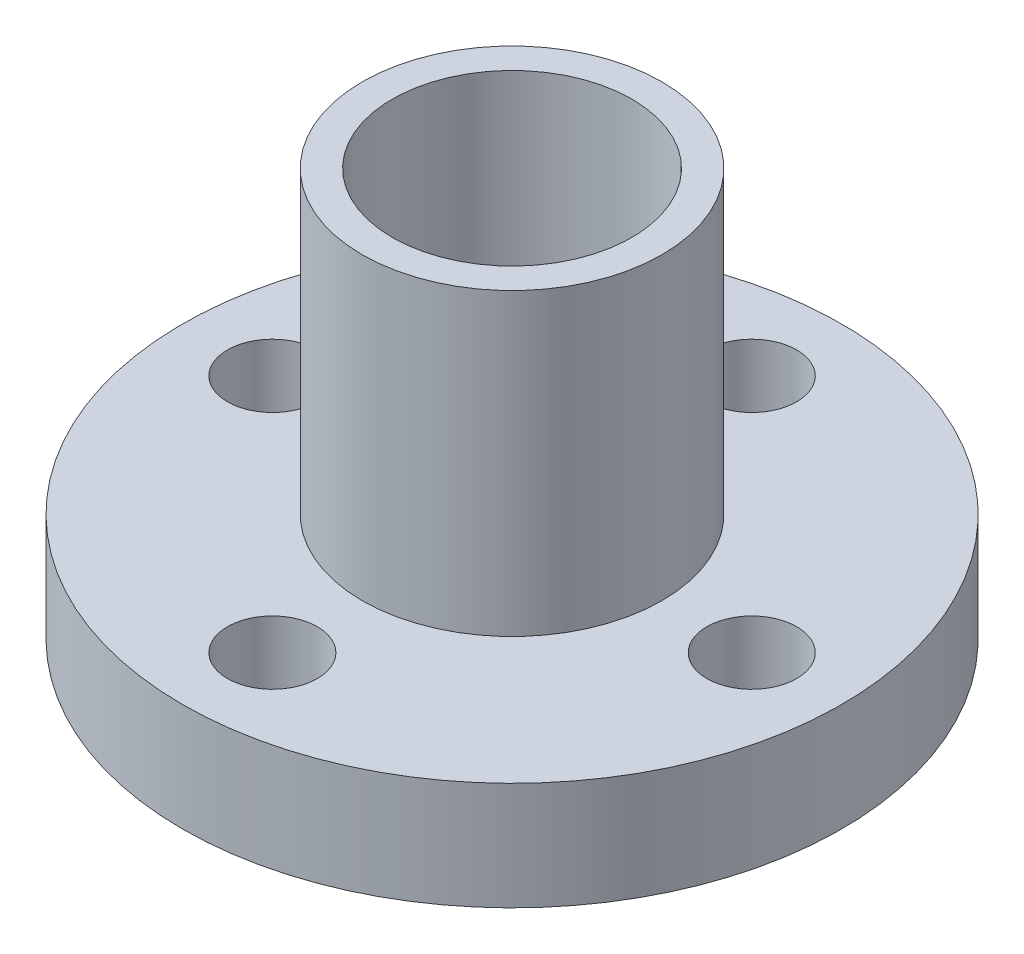
ISO-10303-21;
HEADER;
FILE_DESCRIPTION(('STEP AP214'),'2;1');
FILE_NAME('part.step','',(''),(''),'','','');
FILE_SCHEMA(('AUTOMOTIVE_DESIGN { 1 0 10303 214 1 1 1 1 }'));
ENDSEC;
DATA;
#1=APPLICATION_CONTEXT('core data for automotive mechanical design processes');
#2=APPLICATION_PROTOCOL_DEFINITION('international standard','automotive_design',2000,#1);
#3=PRODUCT_CONTEXT('',#1,'mechanical');
#4=PRODUCT('Part','Part','',(#3));
#5=PRODUCT_RELATED_PRODUCT_CATEGORY('part','',(#4));
#6=PRODUCT_DEFINITION_FORMATION('','',#4);
#7=PRODUCT_DEFINITION_CONTEXT('part definition',#1,'design');
#8=PRODUCT_DEFINITION('design','',#6,#7);
#9=PRODUCT_DEFINITION_SHAPE('','',#8);
#10=(LENGTH_UNIT() NAMED_UNIT(*) SI_UNIT(.MILLI.,.METRE.));
#11=(NAMED_UNIT(*) PLANE_ANGLE_UNIT() SI_UNIT($,.RADIAN.));
#12=(NAMED_UNIT(*) SI_UNIT($,.STERADIAN.) SOLID_ANGLE_UNIT());
#13=UNCERTAINTY_MEASURE_WITH_UNIT(LENGTH_MEASURE(1.E-05),#10,'distance_accuracy_value','');
#14=(GEOMETRIC_REPRESENTATION_CONTEXT(3) GLOBAL_UNCERTAINTY_ASSIGNED_CONTEXT((#13)) GLOBAL_UNIT_ASSIGNED_CONTEXT((#10,
#11,#12)) REPRESENTATION_CONTEXT('',''));
#15=CARTESIAN_POINT('',(0.,0.,0.));
#16=DIRECTION('',(0.,0.,1.));
#17=DIRECTION('',(1.,0.,0.));
#18=AXIS2_PLACEMENT_3D('',#15,#16,#17);
#19=CARTESIAN_POINT('',(0.,3.6,0.));
#20=DIRECTION('',(0.,-1.,0.));
#21=DIRECTION('',(0.,0.,-1.));
#22=AXIS2_PLACEMENT_3D('',#19,#20,#21);
#23=CYLINDRICAL_SURFACE('',#22,11.);
#24=CARTESIAN_POINT('',(0.,3.6,0.));
#25=DIRECTION('',(0.,1.,0.));
#26=DIRECTION('',(0.,0.,1.));
#27=AXIS2_PLACEMENT_3D('',#24,#25,#26);
#28=CIRCLE('',#27,11.);
#29=CARTESIAN_POINT('',(0.,3.6,11.));
#30=VERTEX_POINT('',#29);
#31=EDGE_CURVE('E37',#30,#30,#28,.T.);
#32=ORIENTED_EDGE('',*,*,#31,.F.);
#33=EDGE_LOOP('',(#32));
#34=FACE_BOUND('',#33,.T.);
#35=CARTESIAN_POINT('',(0.,0.,0.));
#36=DIRECTION('',(0.,1.,0.));
#37=DIRECTION('',(0.,0.,1.));
#38=AXIS2_PLACEMENT_3D('',#35,#36,#37);
#39=CIRCLE('',#38,11.);
#40=CARTESIAN_POINT('',(0.,0.,11.));
#41=VERTEX_POINT('',#40);
#42=EDGE_CURVE('E42',#41,#41,#39,.T.);
#43=ORIENTED_EDGE('',*,*,#42,.T.);
#44=EDGE_LOOP('',(#43));
#45=FACE_BOUND('',#44,.T.);
#46=ADVANCED_FACE('F30',(#34,#45),#23,.T.);
#47=CARTESIAN_POINT('',(0.,3.6,0.));
#48=DIRECTION('',(0.,1.,0.));
#49=DIRECTION('',(0.,0.,1.));
#50=AXIS2_PLACEMENT_3D('',#47,#48,#49);
#51=PLANE('',#50);
#52=CARTESIAN_POINT('',(0.,3.6,8.));
#53=DIRECTION('',(0.,1.,0.));
#54=DIRECTION('',(0.,0.,1.));
#55=AXIS2_PLACEMENT_3D('',#52,#53,#54);
#56=CIRCLE('',#55,1.5);
#57=CARTESIAN_POINT('',(0.,3.6,9.5));
#58=VERTEX_POINT('',#57);
#59=EDGE_CURVE('E53',#58,#58,#56,.T.);
#60=ORIENTED_EDGE('',*,*,#59,.F.);
#61=EDGE_LOOP('',(#60));
#62=FACE_BOUND('',#61,.T.);
#63=CARTESIAN_POINT('',(-8.,3.6,0.));
#64=DIRECTION('',(0.,1.,0.));
#65=DIRECTION('',(0.,0.,1.));
#66=AXIS2_PLACEMENT_3D('',#63,#64,#65);
#67=CIRCLE('',#66,1.5);
#68=CARTESIAN_POINT('',(-8.,3.6,1.49999999999992));
#69=VERTEX_POINT('',#68);
#70=EDGE_CURVE('E56',#69,#69,#67,.T.);
#71=ORIENTED_EDGE('',*,*,#70,.F.);
#72=EDGE_LOOP('',(#71));
#73=FACE_BOUND('',#72,.T.);
#74=CARTESIAN_POINT('',(8.,3.6,0.));
#75=DIRECTION('',(0.,1.,0.));
#76=DIRECTION('',(0.,0.,1.));
#77=AXIS2_PLACEMENT_3D('',#74,#75,#76);
#78=CIRCLE('',#77,1.5);
#79=CARTESIAN_POINT('',(8.,3.6,1.50000000000003));
#80=VERTEX_POINT('',#79);
#81=EDGE_CURVE('E50',#80,#80,#78,.T.);
#82=ORIENTED_EDGE('',*,*,#81,.F.);
#83=EDGE_LOOP('',(#82));
#84=FACE_BOUND('',#83,.T.);
#85=CARTESIAN_POINT('',(0.,3.6,-8.));
#86=DIRECTION('',(0.,1.,0.));
#87=DIRECTION('',(0.,0.,1.));
#88=AXIS2_PLACEMENT_3D('',#85,#86,#87);
#89=CIRCLE('',#88,1.5);
#90=CARTESIAN_POINT('',(0.,3.6,-6.5));
#91=VERTEX_POINT('',#90);
#92=EDGE_CURVE('E49',#91,#91,#89,.T.);
#93=ORIENTED_EDGE('',*,*,#92,.F.);
#94=EDGE_LOOP('',(#93));
#95=FACE_BOUND('',#94,.T.);
#96=CARTESIAN_POINT('',(0.,3.6,0.));
#97=DIRECTION('',(0.,1.,0.));
#98=DIRECTION('',(0.,0.,1.));
#99=AXIS2_PLACEMENT_3D('',#96,#97,#98);
#100=CIRCLE('',#99,5.);
#101=CARTESIAN_POINT('',(0.,3.6,5.));
#102=VERTEX_POINT('',#101);
#103=EDGE_CURVE('E80',#102,#102,#100,.T.);
#104=ORIENTED_EDGE('',*,*,#103,.F.);
#105=EDGE_LOOP('',(#104));
#106=FACE_BOUND('',#105,.T.);
#107=ORIENTED_EDGE('',*,*,#31,.T.);
#108=EDGE_LOOP('',(#107));
#109=FACE_BOUND('',#108,.T.);
#110=ADVANCED_FACE('F89',(#62,#73,#84,#95,#106,#109),#51,.T.);
#111=CARTESIAN_POINT('',(0.,0.,0.));
#112=DIRECTION('',(0.,1.,0.));
#113=DIRECTION('',(0.,0.,1.));
#114=AXIS2_PLACEMENT_3D('',#111,#112,#113);
#115=PLANE('',#114);
#116=CARTESIAN_POINT('',(0.,0.,8.));
#117=DIRECTION('',(0.,1.,0.));
#118=DIRECTION('',(0.,0.,1.));
#119=AXIS2_PLACEMENT_3D('',#116,#117,#118);
#120=CIRCLE('',#119,1.5);
#121=CARTESIAN_POINT('',(0.,0.,9.5));
#122=VERTEX_POINT('',#121);
#123=EDGE_CURVE('E33',#122,#122,#120,.T.);
#124=ORIENTED_EDGE('',*,*,#123,.T.);
#125=EDGE_LOOP('',(#124));
#126=FACE_BOUND('',#125,.T.);
#127=CARTESIAN_POINT('',(-8.,0.,0.));
#128=DIRECTION('',(0.,1.,0.));
#129=DIRECTION('',(0.,0.,1.));
#130=AXIS2_PLACEMENT_3D('',#127,#128,#129);
#131=CIRCLE('',#130,1.5);
#132=CARTESIAN_POINT('',(-8.,0.,1.49999999999992));
#133=VERTEX_POINT('',#132);
#134=EDGE_CURVE('E54',#133,#133,#131,.T.);
#135=ORIENTED_EDGE('',*,*,#134,.T.);
#136=EDGE_LOOP('',(#135));
#137=FACE_BOUND('',#136,.T.);
#138=CARTESIAN_POINT('',(8.,0.,0.));
#139=DIRECTION('',(0.,1.,0.));
#140=DIRECTION('',(0.,0.,1.));
#141=AXIS2_PLACEMENT_3D('',#138,#139,#140);
#142=CIRCLE('',#141,1.5);
#143=CARTESIAN_POINT('',(8.,0.,1.50000000000003));
#144=VERTEX_POINT('',#143);
#145=EDGE_CURVE('E51',#144,#144,#142,.T.);
#146=ORIENTED_EDGE('',*,*,#145,.T.);
#147=EDGE_LOOP('',(#146));
#148=FACE_BOUND('',#147,.T.);
#149=CARTESIAN_POINT('',(0.,0.,-8.));
#150=DIRECTION('',(0.,1.,0.));
#151=DIRECTION('',(0.,0.,1.));
#152=AXIS2_PLACEMENT_3D('',#149,#150,#151);
#153=CIRCLE('',#152,1.5);
#154=CARTESIAN_POINT('',(0.,0.,-6.5));
#155=VERTEX_POINT('',#154);
#156=EDGE_CURVE('E46',#155,#155,#153,.T.);
#157=ORIENTED_EDGE('',*,*,#156,.T.);
#158=EDGE_LOOP('',(#157));
#159=FACE_BOUND('',#158,.T.);
#160=CARTESIAN_POINT('',(0.,0.,0.));
#161=DIRECTION('',(0.,1.,0.));
#162=DIRECTION('',(0.,0.,1.));
#163=AXIS2_PLACEMENT_3D('',#160,#161,#162);
#164=CIRCLE('',#163,5.);
#165=CARTESIAN_POINT('',(0.,0.,5.));
#166=VERTEX_POINT('',#165);
#167=EDGE_CURVE('E10',#166,#166,#164,.F.);
#168=ORIENTED_EDGE('',*,*,#167,.F.);
#169=EDGE_LOOP('',(#168));
#170=FACE_BOUND('',#169,.T.);
#171=ORIENTED_EDGE('',*,*,#42,.F.);
#172=EDGE_LOOP('',(#171));
#173=FACE_BOUND('',#172,.T.);
#174=ADVANCED_FACE('F92',(#126,#137,#148,#159,#170,#173),#115,.F.);
#175=CARTESIAN_POINT('',(0.,13.6,0.));
#176=DIRECTION('',(0.,-1.,0.));
#177=DIRECTION('',(0.,0.,-1.));
#178=AXIS2_PLACEMENT_3D('',#175,#176,#177);
#179=CYLINDRICAL_SURFACE('',#178,5.);
#180=CARTESIAN_POINT('',(0.,13.6,0.));
#181=DIRECTION('',(0.,1.,0.));
#182=DIRECTION('',(0.,0.,1.));
#183=AXIS2_PLACEMENT_3D('',#180,#181,#182);
#184=CIRCLE('',#183,5.);
#185=CARTESIAN_POINT('',(0.,13.6,5.));
#186=VERTEX_POINT('',#185);
#187=EDGE_CURVE('E81',#186,#186,#184,.T.);
#188=ORIENTED_EDGE('',*,*,#187,.F.);
#189=EDGE_LOOP('',(#188));
#190=FACE_BOUND('',#189,.T.);
#191=ORIENTED_EDGE('',*,*,#103,.T.);
#192=EDGE_LOOP('',(#191));
#193=FACE_BOUND('',#192,.T.);
#194=ADVANCED_FACE('F87',(#190,#193),#179,.T.);
#195=CARTESIAN_POINT('',(0.,13.6,0.));
#196=DIRECTION('',(0.,1.,0.));
#197=DIRECTION('',(0.,0.,1.));
#198=AXIS2_PLACEMENT_3D('',#195,#196,#197);
#199=PLANE('',#198);
#200=CARTESIAN_POINT('',(0.,13.6,0.));
#201=DIRECTION('',(0.,1.,0.));
#202=DIRECTION('',(0.,0.,1.));
#203=AXIS2_PLACEMENT_3D('',#200,#201,#202);
#204=CIRCLE('',#203,4.);
#205=CARTESIAN_POINT('',(0.,13.6,4.));
#206=VERTEX_POINT('',#205);
#207=EDGE_CURVE('E71',#206,#206,#204,.T.);
#208=ORIENTED_EDGE('',*,*,#207,.F.);
#209=EDGE_LOOP('',(#208));
#210=FACE_BOUND('',#209,.T.);
#211=ORIENTED_EDGE('',*,*,#187,.T.);
#212=EDGE_LOOP('',(#211));
#213=FACE_BOUND('',#212,.T.);
#214=ADVANCED_FACE('F107',(#210,#213),#199,.T.);
#215=CARTESIAN_POINT('',(0.,-1.5,0.));
#216=DIRECTION('',(0.,1.,0.));
#217=DIRECTION('',(0.,0.,1.));
#218=AXIS2_PLACEMENT_3D('',#215,#216,#217);
#219=CYLINDRICAL_SURFACE('',#218,5.);
#220=CARTESIAN_POINT('',(0.,-1.5,0.));
#221=DIRECTION('',(0.,-1.,0.));
#222=DIRECTION('',(0.,0.,-1.));
#223=AXIS2_PLACEMENT_3D('',#220,#221,#222);
#224=CIRCLE('',#223,5.);
#225=CARTESIAN_POINT('',(0.,-1.5,-5.));
#226=VERTEX_POINT('',#225);
#227=EDGE_CURVE('E75',#226,#226,#224,.T.);
#228=ORIENTED_EDGE('',*,*,#227,.F.);
#229=EDGE_LOOP('',(#228));
#230=FACE_BOUND('',#229,.T.);
#231=ORIENTED_EDGE('',*,*,#167,.T.);
#232=EDGE_LOOP('',(#231));
#233=FACE_BOUND('',#232,.T.);
#234=ADVANCED_FACE('F113',(#230,#233),#219,.T.);
#235=CARTESIAN_POINT('',(0.,-1.5,0.));
#236=DIRECTION('',(0.,-1.,0.));
#237=DIRECTION('',(0.,0.,-1.));
#238=AXIS2_PLACEMENT_3D('',#235,#236,#237);
#239=PLANE('',#238);
#240=CARTESIAN_POINT('',(0.,-1.5,0.));
#241=DIRECTION('',(0.,1.,0.));
#242=DIRECTION('',(0.,0.,1.));
#243=AXIS2_PLACEMENT_3D('',#240,#241,#242);
#244=CIRCLE('',#243,4.);
#245=CARTESIAN_POINT('',(0.,-1.5,4.));
#246=VERTEX_POINT('',#245);
#247=EDGE_CURVE('E72',#246,#246,#244,.T.);
#248=ORIENTED_EDGE('',*,*,#247,.T.);
#249=EDGE_LOOP('',(#248));
#250=FACE_BOUND('',#249,.T.);
#251=ORIENTED_EDGE('',*,*,#227,.T.);
#252=EDGE_LOOP('',(#251));
#253=FACE_BOUND('',#252,.T.);
#254=ADVANCED_FACE('F117',(#250,#253),#239,.T.);
#255=CARTESIAN_POINT('',(0.,-1.5,0.));
#256=DIRECTION('',(0.,1.,0.));
#257=DIRECTION('',(0.,0.,1.));
#258=AXIS2_PLACEMENT_3D('',#255,#256,#257);
#259=CYLINDRICAL_SURFACE('',#258,4.);
#260=CARTESIAN_POINT('',(0.,-1.5,4.));
#261=CARTESIAN_POINT('',(0.,-1.34270833333333,4.));
#262=CARTESIAN_POINT('',(0.,-1.18541666666667,4.));
#263=CARTESIAN_POINT('',(0.,-0.870833333333333,4.));
#264=CARTESIAN_POINT('',(0.,-0.713541666666666,4.));
#265=CARTESIAN_POINT('',(0.,-0.398958333333333,4.));
#266=CARTESIAN_POINT('',(0.,-0.241666666666666,4.));
#267=CARTESIAN_POINT('',(0.,0.0729166666666669,4.));
#268=CARTESIAN_POINT('',(0.,0.230208333333334,4.));
#269=CARTESIAN_POINT('',(0.,0.544791666666667,4.));
#270=CARTESIAN_POINT('',(0.,0.702083333333334,4.));
#271=CARTESIAN_POINT('',(0.,1.01666666666667,4.));
#272=CARTESIAN_POINT('',(0.,1.17395833333333,4.));
#273=CARTESIAN_POINT('',(0.,1.48854166666667,4.));
#274=CARTESIAN_POINT('',(0.,1.64583333333333,4.));
#275=CARTESIAN_POINT('',(0.,1.96041666666667,4.));
#276=CARTESIAN_POINT('',(0.,2.11770833333333,4.));
#277=CARTESIAN_POINT('',(0.,2.43229166666667,4.));
#278=CARTESIAN_POINT('',(0.,2.58958333333333,4.));
#279=CARTESIAN_POINT('',(0.,2.90416666666667,4.));
#280=CARTESIAN_POINT('',(0.,3.06145833333333,4.));
#281=CARTESIAN_POINT('',(0.,3.37604166666667,4.));
#282=CARTESIAN_POINT('',(0.,3.53333333333333,4.));
#283=CARTESIAN_POINT('',(0.,3.84791666666667,4.));
#284=CARTESIAN_POINT('',(0.,4.00520833333333,4.));
#285=CARTESIAN_POINT('',(0.,4.31979166666667,4.));
#286=CARTESIAN_POINT('',(0.,4.47708333333333,4.));
#287=CARTESIAN_POINT('',(0.,4.79166666666667,4.));
#288=CARTESIAN_POINT('',(0.,4.94895833333333,4.));
#289=CARTESIAN_POINT('',(0.,5.26354166666667,4.));
#290=CARTESIAN_POINT('',(0.,5.42083333333333,4.));
#291=CARTESIAN_POINT('',(0.,5.73541666666667,4.));
#292=CARTESIAN_POINT('',(0.,5.89270833333333,4.));
#293=CARTESIAN_POINT('',(0.,6.20729166666667,4.));
#294=CARTESIAN_POINT('',(0.,6.36458333333333,4.));
#295=CARTESIAN_POINT('',(0.,6.67916666666667,4.));
#296=CARTESIAN_POINT('',(0.,6.83645833333333,4.));
#297=CARTESIAN_POINT('',(0.,7.15104166666667,4.));
#298=CARTESIAN_POINT('',(0.,7.30833333333333,4.));
#299=CARTESIAN_POINT('',(0.,7.62291666666667,4.));
#300=CARTESIAN_POINT('',(0.,7.78020833333333,4.));
#301=CARTESIAN_POINT('',(0.,8.09479166666667,4.));
#302=CARTESIAN_POINT('',(0.,8.25208333333333,4.));
#303=CARTESIAN_POINT('',(0.,8.56666666666667,4.));
#304=CARTESIAN_POINT('',(0.,8.72395833333333,4.));
#305=CARTESIAN_POINT('',(0.,9.03854166666667,4.));
#306=CARTESIAN_POINT('',(0.,9.19583333333333,4.));
#307=CARTESIAN_POINT('',(0.,9.51041666666667,4.));
#308=CARTESIAN_POINT('',(0.,9.66770833333333,4.));
#309=CARTESIAN_POINT('',(0.,9.98229166666667,4.));
#310=CARTESIAN_POINT('',(0.,10.1395833333333,4.));
#311=CARTESIAN_POINT('',(0.,10.4541666666667,4.));
#312=CARTESIAN_POINT('',(0.,10.6114583333333,4.));
#313=CARTESIAN_POINT('',(0.,10.9260416666667,4.));
#314=CARTESIAN_POINT('',(0.,11.0833333333333,4.));
#315=CARTESIAN_POINT('',(0.,11.3979166666667,4.));
#316=CARTESIAN_POINT('',(0.,11.5552083333333,4.));
#317=CARTESIAN_POINT('',(0.,11.8697916666667,4.));
#318=CARTESIAN_POINT('',(0.,12.0270833333333,4.));
#319=CARTESIAN_POINT('',(0.,12.3416666666667,4.));
#320=CARTESIAN_POINT('',(0.,12.4989583333333,4.));
#321=CARTESIAN_POINT('',(0.,12.8135416666667,4.));
#322=CARTESIAN_POINT('',(0.,12.9708333333333,4.));
#323=CARTESIAN_POINT('',(0.,13.2854166666667,4.));
#324=CARTESIAN_POINT('',(0.,13.4427083333333,4.));
#325=CARTESIAN_POINT('',(0.,13.6,4.));
#326=B_SPLINE_CURVE_WITH_KNOTS('',3,(#260,#261,#262,#263,#264,#265,#266,#267,#268,#269,#270,
#271,#272,#273,#274,#275,#276,#277,#278,#279,#280,#281,#282,#283,#284,#285,#286,#287,#288,#289,
#290,#291,#292,#293,#294,#295,#296,#297,#298,#299,#300,#301,#302,#303,#304,#305,#306,#307,#308,
#309,#310,#311,#312,#313,#314,#315,#316,#317,#318,#319,#320,#321,#322,#323,#324,#325),
.UNSPECIFIED.,.F.,.F.,(4,2,2,2,2,2,2,2,2,2,2,2,2,2,2,2,2,2,2,2,2,2,2,2,2,2,2,2,2,2,2,2,4),(0.,
0.471875,0.94375,1.415625,1.8875,2.359375,2.83125,3.303125,3.775,4.246875,4.71875,5.190625,
5.6625,6.134375,6.60625,7.078125,7.55,8.021875,8.49375,8.965625,9.4375,9.909375,10.38125,
10.853125,11.325,11.796875,12.26875,12.740625,13.2125,13.684375,14.15625,14.628125,15.1),.UNSPECIFIED.);
#327=EDGE_CURVE('BSEAM121',#246,#206,#326,.T.);
#328=ORIENTED_EDGE('',*,*,#247,.F.);
#329=ORIENTED_EDGE('',*,*,#207,.T.);
#330=ORIENTED_EDGE('',*,*,#327,.T.);
#331=ORIENTED_EDGE('',*,*,#327,.F.);
#332=EDGE_LOOP('',(#328,#330,#329,#331));
#333=FACE_BOUND('',#332,.T.);
#334=ADVANCED_FACE('F121',(#333),#259,.F.);
#335=CARTESIAN_POINT('',(0.,-1.5,-8.));
#336=DIRECTION('',(0.,1.,0.));
#337=DIRECTION('',(0.,0.,1.));
#338=AXIS2_PLACEMENT_3D('',#335,#336,#337);
#339=CYLINDRICAL_SURFACE('',#338,1.5);
#340=ORIENTED_EDGE('',*,*,#92,.T.);
#341=EDGE_LOOP('',(#340));
#342=FACE_BOUND('',#341,.T.);
#343=ORIENTED_EDGE('',*,*,#156,.F.);
#344=EDGE_LOOP('',(#343));
#345=FACE_BOUND('',#344,.T.);
#346=ADVANCED_FACE('F125',(#342,#345),#339,.F.);
#347=CARTESIAN_POINT('',(8.,-1.5,0.));
#348=DIRECTION('',(0.,1.,0.));
#349=DIRECTION('',(0.,0.,1.));
#350=AXIS2_PLACEMENT_3D('',#347,#348,#349);
#351=CYLINDRICAL_SURFACE('',#350,1.5);
#352=ORIENTED_EDGE('',*,*,#81,.T.);
#353=EDGE_LOOP('',(#352));
#354=FACE_BOUND('',#353,.T.);
#355=ORIENTED_EDGE('',*,*,#145,.F.);
#356=EDGE_LOOP('',(#355));
#357=FACE_BOUND('',#356,.T.);
#358=ADVANCED_FACE('F129',(#354,#357),#351,.F.);
#359=CARTESIAN_POINT('',(-8.,-1.5,0.));
#360=DIRECTION('',(0.,1.,0.));
#361=DIRECTION('',(0.,0.,1.));
#362=AXIS2_PLACEMENT_3D('',#359,#360,#361);
#363=CYLINDRICAL_SURFACE('',#362,1.5);
#364=ORIENTED_EDGE('',*,*,#70,.T.);
#365=EDGE_LOOP('',(#364));
#366=FACE_BOUND('',#365,.T.);
#367=ORIENTED_EDGE('',*,*,#134,.F.);
#368=EDGE_LOOP('',(#367));
#369=FACE_BOUND('',#368,.T.);
#370=ADVANCED_FACE('F133',(#366,#369),#363,.F.);
#371=CARTESIAN_POINT('',(0.,-1.5,8.));
#372=DIRECTION('',(0.,1.,0.));
#373=DIRECTION('',(0.,0.,1.));
#374=AXIS2_PLACEMENT_3D('',#371,#372,#373);
#375=CYLINDRICAL_SURFACE('',#374,1.5);
#376=ORIENTED_EDGE('',*,*,#59,.T.);
#377=EDGE_LOOP('',(#376));
#378=FACE_BOUND('',#377,.T.);
#379=ORIENTED_EDGE('',*,*,#123,.F.);
#380=EDGE_LOOP('',(#379));
#381=FACE_BOUND('',#380,.T.);
#382=ADVANCED_FACE('F137',(#378,#381),#375,.F.);
#383=CLOSED_SHELL('',(#46,#110,#174,#194,#214,#234,#254,#334,#346,#358,#370,#382));
#384=MANIFOLD_SOLID_BREP('B2',#383);
#385=ADVANCED_BREP_SHAPE_REPRESENTATION('',(#18,#384),#14);
#386=SHAPE_DEFINITION_REPRESENTATION(#9,#385);
ENDSEC;
END-ISO-10303-21;
